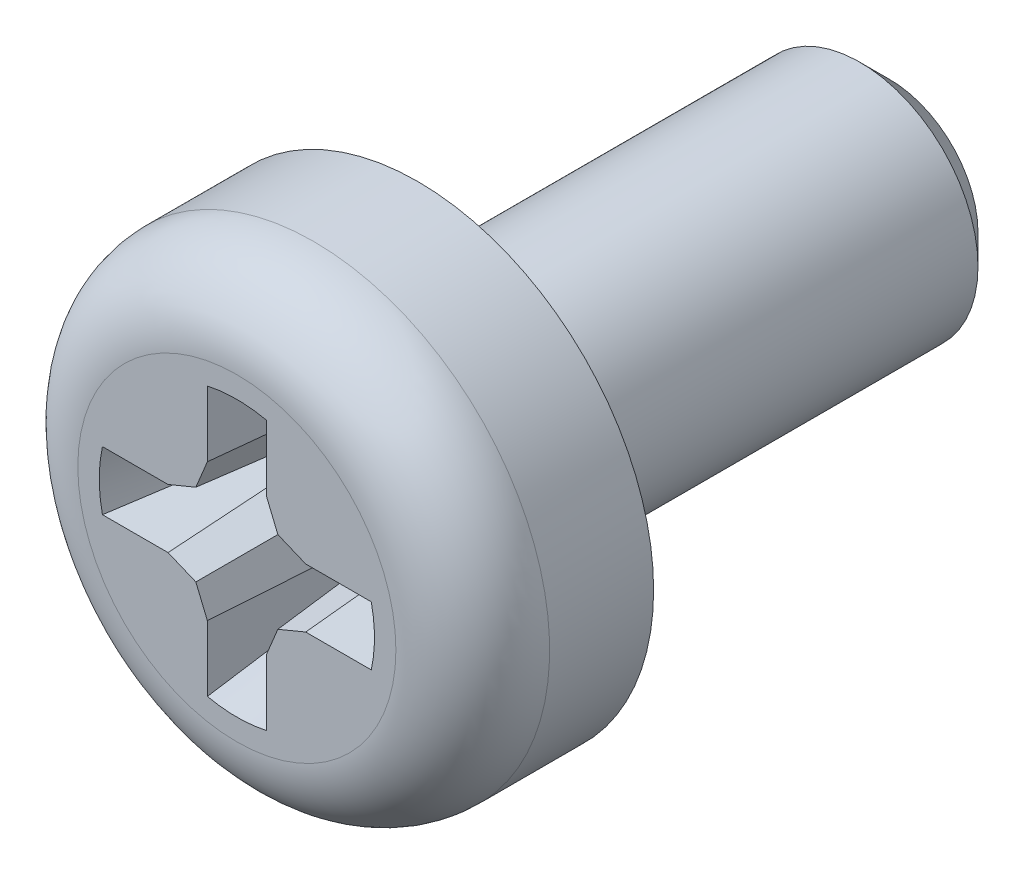
ISO-10303-21;
HEADER;
FILE_DESCRIPTION(('STEP AP214'),'2;1');
FILE_NAME('part.step','',(''),(''),'','','');
FILE_SCHEMA(('AUTOMOTIVE_DESIGN { 1 0 10303 214 1 1 1 1 }'));
ENDSEC;
DATA;
#1=APPLICATION_CONTEXT('core data for automotive mechanical design processes');
#2=APPLICATION_PROTOCOL_DEFINITION('international standard','automotive_design',2000,#1);
#3=PRODUCT_CONTEXT('',#1,'mechanical');
#4=PRODUCT('Part','Part','',(#3));
#5=PRODUCT_RELATED_PRODUCT_CATEGORY('part','',(#4));
#6=PRODUCT_DEFINITION_FORMATION('','',#4);
#7=PRODUCT_DEFINITION_CONTEXT('part definition',#1,'design');
#8=PRODUCT_DEFINITION('design','',#6,#7);
#9=PRODUCT_DEFINITION_SHAPE('','',#8);
#10=(LENGTH_UNIT() NAMED_UNIT(*) SI_UNIT(.MILLI.,.METRE.));
#11=(NAMED_UNIT(*) PLANE_ANGLE_UNIT() SI_UNIT($,.RADIAN.));
#12=(NAMED_UNIT(*) SI_UNIT($,.STERADIAN.) SOLID_ANGLE_UNIT());
#13=UNCERTAINTY_MEASURE_WITH_UNIT(LENGTH_MEASURE(1.E-05),#10,'distance_accuracy_value','');
#14=(GEOMETRIC_REPRESENTATION_CONTEXT(3) GLOBAL_UNCERTAINTY_ASSIGNED_CONTEXT((#13)) GLOBAL_UNIT_ASSIGNED_CONTEXT((#10,
#11,#12)) REPRESENTATION_CONTEXT('',''));
#15=CARTESIAN_POINT('',(0.,0.,0.));
#16=DIRECTION('',(0.,0.,1.));
#17=DIRECTION('',(1.,0.,0.));
#18=AXIS2_PLACEMENT_3D('',#15,#16,#17);
#19=CARTESIAN_POINT('',(0.,0.,0.));
#20=DIRECTION('',(0.,0.,1.));
#21=DIRECTION('',(1.,0.,0.));
#22=AXIS2_PLACEMENT_3D('',#19,#20,#21);
#23=PLANE('',#22);
#24=CARTESIAN_POINT('',(0.,0.,0.));
#25=DIRECTION('',(0.,0.,1.));
#26=DIRECTION('',(1.,0.,0.));
#27=AXIS2_PLACEMENT_3D('',#24,#25,#26);
#28=CIRCLE('',#27,6.);
#29=CARTESIAN_POINT('',(6.,0.,0.));
#30=VERTEX_POINT('',#29);
#31=EDGE_CURVE('E56',#30,#30,#28,.T.);
#32=ORIENTED_EDGE('',*,*,#31,.F.);
#33=EDGE_LOOP('',(#32));
#34=FACE_BOUND('',#33,.T.);
#35=CARTESIAN_POINT('',(0.,0.,0.));
#36=DIRECTION('',(0.,0.,1.));
#37=DIRECTION('',(1.,0.,0.));
#38=AXIS2_PLACEMENT_3D('',#35,#36,#37);
#39=CIRCLE('',#38,3.);
#40=CARTESIAN_POINT('',(3.,0.,0.));
#41=VERTEX_POINT('',#40);
#42=EDGE_CURVE('E11',#41,#41,#39,.F.);
#43=ORIENTED_EDGE('',*,*,#42,.F.);
#44=EDGE_LOOP('',(#43));
#45=FACE_BOUND('',#44,.T.);
#46=ADVANCED_FACE('F39',(#34,#45),#23,.F.);
#47=CARTESIAN_POINT('',(0.,0.,4.6));
#48=DIRECTION('',(0.,0.,-1.));
#49=DIRECTION('',(-1.,0.,0.));
#50=AXIS2_PLACEMENT_3D('',#47,#48,#49);
#51=CYLINDRICAL_SURFACE('',#50,6.);
#52=CARTESIAN_POINT('',(0.,0.,2.645));
#53=DIRECTION('',(0.,0.,-1.));
#54=DIRECTION('',(0.,1.,0.));
#55=AXIS2_PLACEMENT_3D('',#52,#53,#54);
#56=CIRCLE('',#55,6.);
#57=CARTESIAN_POINT('',(0.,6.,2.645));
#58=VERTEX_POINT('',#57);
#59=EDGE_CURVE('E456',#58,#58,#56,.T.);
#60=ORIENTED_EDGE('',*,*,#59,.T.);
#61=EDGE_LOOP('',(#60));
#62=FACE_BOUND('',#61,.T.);
#63=ORIENTED_EDGE('',*,*,#31,.T.);
#64=EDGE_LOOP('',(#63));
#65=FACE_BOUND('',#64,.T.);
#66=ADVANCED_FACE('F382',(#62,#65),#51,.T.);
#67=CARTESIAN_POINT('',(0.,0.,2.645));
#68=DIRECTION('',(0.,0.,-1.));
#69=DIRECTION('',(0.,1.,0.));
#70=AXIS2_PLACEMENT_3D('',#67,#68,#69);
#71=TOROIDAL_SURFACE('',#70,4.045,1.955);
#72=ORIENTED_EDGE('',*,*,#59,.F.);
#73=EDGE_LOOP('',(#72));
#74=FACE_BOUND('',#73,.T.);
#75=CARTESIAN_POINT('',(0.,0.,4.6));
#76=DIRECTION('',(0.,0.,-1.));
#77=DIRECTION('',(0.,1.,0.));
#78=AXIS2_PLACEMENT_3D('',#75,#76,#77);
#79=CIRCLE('',#78,4.045);
#80=CARTESIAN_POINT('',(0.,4.045,4.6));
#81=VERTEX_POINT('',#80);
#82=EDGE_CURVE('E452',#81,#81,#79,.T.);
#83=ORIENTED_EDGE('',*,*,#82,.T.);
#84=EDGE_LOOP('',(#83));
#85=FACE_BOUND('',#84,.T.);
#86=ADVANCED_FACE('F388',(#74,#85),#71,.T.);
#87=CARTESIAN_POINT('',(0.,0.,4.6));
#88=DIRECTION('',(0.,0.,1.));
#89=DIRECTION('',(1.,0.,0.));
#90=AXIS2_PLACEMENT_3D('',#87,#88,#89);
#91=PLANE('',#90);
#92=DIRECTION('',(0.,-1.,0.));
#93=VECTOR('',#92,1.);
#94=CARTESIAN_POINT('',(-0.750000000000007,1.75,4.6));
#95=LINE('',#94,#93);
#96=CARTESIAN_POINT('',(-0.750000000000013,3.41869858279433,4.6));
#97=VERTEX_POINT('',#96);
#98=CARTESIAN_POINT('',(-0.750000000000007,1.75,4.6));
#99=VERTEX_POINT('',#98);
#100=EDGE_CURVE('E337',#97,#99,#95,.T.);
#101=ORIENTED_EDGE('',*,*,#100,.F.);
#102=CARTESIAN_POINT('',(0.,0.,4.6));
#103=DIRECTION('',(0.,0.,1.));
#104=DIRECTION('',(1.,0.,0.));
#105=AXIS2_PLACEMENT_3D('',#102,#103,#104);
#106=CIRCLE('',#105,3.5);
#107=CARTESIAN_POINT('',(0.75,3.41869858279434,4.6));
#108=VERTEX_POINT('',#107);
#109=EDGE_CURVE('E344',#108,#97,#106,.T.);
#110=ORIENTED_EDGE('',*,*,#109,.F.);
#111=DIRECTION('',(0.,1.,0.));
#112=VECTOR('',#111,1.);
#113=CARTESIAN_POINT('',(0.75,3.41869858279434,4.6));
#114=LINE('',#113,#112);
#115=CARTESIAN_POINT('',(0.75,1.75,4.6));
#116=VERTEX_POINT('',#115);
#117=EDGE_CURVE('E440',#116,#108,#114,.T.);
#118=ORIENTED_EDGE('',*,*,#117,.F.);
#119=DIRECTION('',(-0.382683432365083,0.923879532511289,0.));
#120=VECTOR('',#119,1.);
#121=CARTESIAN_POINT('',(0.75,1.75,4.6));
#122=LINE('',#121,#120);
#123=CARTESIAN_POINT('',(1.04289321881345,1.04289321881345,4.6));
#124=VERTEX_POINT('',#123);
#125=EDGE_CURVE('E434',#124,#116,#122,.T.);
#126=ORIENTED_EDGE('',*,*,#125,.F.);
#127=DIRECTION('',(-0.92387953251129,0.382683432365083,0.));
#128=VECTOR('',#127,1.);
#129=CARTESIAN_POINT('',(1.75,0.750000000000001,4.6));
#130=LINE('',#129,#128);
#131=CARTESIAN_POINT('',(1.75,0.750000000000001,4.6));
#132=VERTEX_POINT('',#131);
#133=EDGE_CURVE('E193',#132,#124,#130,.T.);
#134=ORIENTED_EDGE('',*,*,#133,.F.);
#135=DIRECTION('',(-1.,0.,0.));
#136=VECTOR('',#135,1.);
#137=CARTESIAN_POINT('',(1.75,0.750000000000001,4.6));
#138=LINE('',#137,#136);
#139=CARTESIAN_POINT('',(3.41869858279434,0.750000000000001,4.6));
#140=VERTEX_POINT('',#139);
#141=EDGE_CURVE('E426',#140,#132,#138,.T.);
#142=ORIENTED_EDGE('',*,*,#141,.F.);
#143=CARTESIAN_POINT('',(0.,0.,4.6));
#144=DIRECTION('',(0.,0.,1.));
#145=DIRECTION('',(1.,0.,0.));
#146=AXIS2_PLACEMENT_3D('',#143,#144,#145);
#147=CIRCLE('',#146,3.5);
#148=CARTESIAN_POINT('',(3.41869858279434,-0.749999999999964,4.6));
#149=VERTEX_POINT('',#148);
#150=EDGE_CURVE('E290',#149,#140,#147,.T.);
#151=ORIENTED_EDGE('',*,*,#150,.F.);
#152=DIRECTION('',(1.,0.,0.));
#153=VECTOR('',#152,1.);
#154=CARTESIAN_POINT('',(3.41869858279434,-0.749999999999964,4.6));
#155=LINE('',#154,#153);
#156=CARTESIAN_POINT('',(1.75000000000001,-0.749999999999982,4.6));
#157=VERTEX_POINT('',#156);
#158=EDGE_CURVE('E519',#157,#149,#155,.T.);
#159=ORIENTED_EDGE('',*,*,#158,.F.);
#160=DIRECTION('',(0.923879532511285,0.382683432365093,0.));
#161=VECTOR('',#160,1.);
#162=CARTESIAN_POINT('',(1.75000000000001,-0.749999999999982,4.6));
#163=LINE('',#162,#161);
#164=CARTESIAN_POINT('',(1.04289321881346,-1.04289321881344,4.6));
#165=VERTEX_POINT('',#164);
#166=EDGE_CURVE('E522',#165,#157,#163,.T.);
#167=ORIENTED_EDGE('',*,*,#166,.F.);
#168=DIRECTION('',(0.382683432365073,0.923879532511294,0.));
#169=VECTOR('',#168,1.);
#170=CARTESIAN_POINT('',(0.750000000000019,-1.74999999999999,4.6));
#171=LINE('',#170,#169);
#172=CARTESIAN_POINT('',(0.750000000000019,-1.74999999999999,4.6));
#173=VERTEX_POINT('',#172);
#174=EDGE_CURVE('E525',#173,#165,#171,.T.);
#175=ORIENTED_EDGE('',*,*,#174,.F.);
#176=DIRECTION('',(0.,1.,0.));
#177=VECTOR('',#176,1.);
#178=CARTESIAN_POINT('',(0.750000000000019,-1.74999999999999,4.6));
#179=LINE('',#178,#177);
#180=CARTESIAN_POINT('',(0.750000000000037,-3.41869858279433,4.6));
#181=VERTEX_POINT('',#180);
#182=EDGE_CURVE('E528',#181,#173,#179,.T.);
#183=ORIENTED_EDGE('',*,*,#182,.F.);
#184=CARTESIAN_POINT('',(0.,0.,4.6));
#185=DIRECTION('',(0.,0.,1.));
#186=DIRECTION('',(-1.,0.,0.));
#187=AXIS2_PLACEMENT_3D('',#184,#185,#186);
#188=CIRCLE('',#187,3.5);
#189=CARTESIAN_POINT('',(-0.749999999999976,-3.41869858279434,4.6));
#190=VERTEX_POINT('',#189);
#191=EDGE_CURVE('E499',#190,#181,#188,.T.);
#192=ORIENTED_EDGE('',*,*,#191,.F.);
#193=DIRECTION('',(0.,-1.,0.));
#194=VECTOR('',#193,1.);
#195=CARTESIAN_POINT('',(-0.749999999999976,-3.41869858279434,4.6));
#196=LINE('',#195,#194);
#197=CARTESIAN_POINT('',(-0.749999999999988,-1.75,4.6));
#198=VERTEX_POINT('',#197);
#199=EDGE_CURVE('E503',#198,#190,#196,.T.);
#200=ORIENTED_EDGE('',*,*,#199,.F.);
#201=DIRECTION('',(0.38268343236509,-0.923879532511287,0.));
#202=VECTOR('',#201,1.);
#203=CARTESIAN_POINT('',(-0.749999999999988,-1.75,4.6));
#204=LINE('',#203,#202);
#205=CARTESIAN_POINT('',(-1.04289321881344,-1.04289321881346,4.6));
#206=VERTEX_POINT('',#205);
#207=EDGE_CURVE('E507',#206,#198,#204,.T.);
#208=ORIENTED_EDGE('',*,*,#207,.F.);
#209=DIRECTION('',(0.923879532511292,-0.382683432365077,0.));
#210=VECTOR('',#209,1.);
#211=CARTESIAN_POINT('',(-1.74999999999999,-0.750000000000013,4.6));
#212=LINE('',#211,#210);
#213=CARTESIAN_POINT('',(-1.74999999999999,-0.750000000000013,4.6));
#214=VERTEX_POINT('',#213);
#215=EDGE_CURVE('E511',#214,#206,#212,.T.);
#216=ORIENTED_EDGE('',*,*,#215,.F.);
#217=DIRECTION('',(1.,0.,0.));
#218=VECTOR('',#217,1.);
#219=CARTESIAN_POINT('',(-1.74999999999999,-0.750000000000013,4.6));
#220=LINE('',#219,#218);
#221=CARTESIAN_POINT('',(-3.41869858279433,-0.750000000000025,4.6));
#222=VERTEX_POINT('',#221);
#223=EDGE_CURVE('E515',#222,#214,#220,.T.);
#224=ORIENTED_EDGE('',*,*,#223,.F.);
#225=CARTESIAN_POINT('',(0.,0.,4.6));
#226=DIRECTION('',(0.,0.,1.));
#227=DIRECTION('',(0.,1.,0.));
#228=AXIS2_PLACEMENT_3D('',#225,#226,#227);
#229=CIRCLE('',#228,3.5);
#230=CARTESIAN_POINT('',(-3.41869858279434,0.749999999999988,4.6));
#231=VERTEX_POINT('',#230);
#232=EDGE_CURVE('E138',#231,#222,#229,.T.);
#233=ORIENTED_EDGE('',*,*,#232,.F.);
#234=DIRECTION('',(-1.,0.,0.));
#235=VECTOR('',#234,1.);
#236=CARTESIAN_POINT('',(-3.41869858279434,0.749999999999988,4.6));
#237=LINE('',#236,#235);
#238=CARTESIAN_POINT('',(-1.75,0.749999999999994,4.6));
#239=VERTEX_POINT('',#238);
#240=EDGE_CURVE('E484',#239,#231,#237,.T.);
#241=ORIENTED_EDGE('',*,*,#240,.F.);
#242=DIRECTION('',(-0.923879532511288,-0.382683432365087,0.));
#243=VECTOR('',#242,1.);
#244=CARTESIAN_POINT('',(-1.75,0.749999999999994,4.6));
#245=LINE('',#244,#243);
#246=CARTESIAN_POINT('',(-1.04289321881345,1.04289321881344,4.6));
#247=VERTEX_POINT('',#246);
#248=EDGE_CURVE('E487',#247,#239,#245,.T.);
#249=ORIENTED_EDGE('',*,*,#248,.F.);
#250=DIRECTION('',(-0.38268343236508,-0.923879532511291,0.));
#251=VECTOR('',#250,1.);
#252=CARTESIAN_POINT('',(-0.750000000000007,1.75,4.6));
#253=LINE('',#252,#251);
#254=EDGE_CURVE('E493',#99,#247,#253,.T.);
#255=ORIENTED_EDGE('',*,*,#254,.F.);
#256=EDGE_LOOP('',(#101,#110,#118,#126,#134,#142,#151,#159,#167,#175,#183,#192,#200,#208,#216,
#224,#233,#241,#249,#255));
#257=FACE_BOUND('',#256,.T.);
#258=ORIENTED_EDGE('',*,*,#82,.F.);
#259=EDGE_LOOP('',(#258));
#260=FACE_BOUND('',#259,.T.);
#261=ADVANCED_FACE('F393',(#257,#260),#91,.T.);
#262=CARTESIAN_POINT('',(0.,0.,-12.));
#263=DIRECTION('',(0.,0.,1.));
#264=DIRECTION('',(1.,0.,0.));
#265=AXIS2_PLACEMENT_3D('',#262,#263,#264);
#266=PLANE('',#265);
#267=CARTESIAN_POINT('',(0.,0.,-12.));
#268=DIRECTION('',(0.,0.,1.));
#269=DIRECTION('',(1.,0.,0.));
#270=AXIS2_PLACEMENT_3D('',#267,#268,#269);
#271=CIRCLE('',#270,2.25);
#272=CARTESIAN_POINT('',(2.25,0.,-12.));
#273=VERTEX_POINT('',#272);
#274=EDGE_CURVE('E448',#273,#273,#271,.F.);
#275=ORIENTED_EDGE('',*,*,#274,.T.);
#276=EDGE_LOOP('',(#275));
#277=FACE_BOUND('',#276,.T.);
#278=ADVANCED_FACE('F396',(#277),#266,.F.);
#279=CARTESIAN_POINT('',(0.,0.,0.));
#280=DIRECTION('',(0.,0.,1.));
#281=DIRECTION('',(1.,0.,0.));
#282=AXIS2_PLACEMENT_3D('',#279,#280,#281);
#283=CYLINDRICAL_SURFACE('',#282,3.);
#284=CARTESIAN_POINT('',(0.,0.,-11.25));
#285=DIRECTION('',(0.,0.,1.));
#286=DIRECTION('',(1.,0.,0.));
#287=AXIS2_PLACEMENT_3D('',#284,#285,#286);
#288=CIRCLE('',#287,3.);
#289=CARTESIAN_POINT('',(3.,0.,-11.25));
#290=VERTEX_POINT('',#289);
#291=EDGE_CURVE('E229',#290,#290,#288,.T.);
#292=ORIENTED_EDGE('',*,*,#291,.T.);
#293=EDGE_LOOP('',(#292));
#294=FACE_BOUND('',#293,.T.);
#295=ORIENTED_EDGE('',*,*,#42,.T.);
#296=EDGE_LOOP('',(#295));
#297=FACE_BOUND('',#296,.T.);
#298=ADVANCED_FACE('F403',(#294,#297),#283,.T.);
#299=CARTESIAN_POINT('',(0.,0.,-11.25));
#300=DIRECTION('',(0.,0.,1.));
#301=DIRECTION('',(1.,0.,0.));
#302=AXIS2_PLACEMENT_3D('',#299,#300,#301);
#303=CONICAL_SURFACE('',#302,3.,0.78539816339745);
#304=ORIENTED_EDGE('',*,*,#274,.F.);
#305=EDGE_LOOP('',(#304));
#306=FACE_BOUND('',#305,.T.);
#307=ORIENTED_EDGE('',*,*,#291,.F.);
#308=EDGE_LOOP('',(#307));
#309=FACE_BOUND('',#308,.T.);
#310=ADVANCED_FACE('F238',(#306,#309),#303,.T.);
#311=CARTESIAN_POINT('',(0.,0.,4.6));
#312=DIRECTION('',(0.,0.,1.));
#313=DIRECTION('',(1.,0.,0.));
#314=AXIS2_PLACEMENT_3D('',#311,#312,#313);
#315=CONICAL_SURFACE('',#314,3.5,0.26179938779915);
#316=ORIENTED_EDGE('',*,*,#109,.T.);
#317=CARTESIAN_POINT('',(-0.750000000000013,3.41869858279433,4.6));
#318=CARTESIAN_POINT('',(-0.710856778549137,3.30454759683965,4.15259093151792));
#319=CARTESIAN_POINT('',(-0.671715101074905,3.1903268185757,3.70519951076964));
#320=CARTESIAN_POINT('',(-0.593436589596938,2.96166801188712,2.81047203039419));
#321=CARTESIAN_POINT('',(-0.554299755590619,2.84722998357892,2.36313597073748));
#322=CARTESIAN_POINT('',(-0.476032630076546,2.61805884652935,1.46853863252485));
#323=CARTESIAN_POINT('',(-0.436902338571229,2.50332573767834,1.02127735399678));
#324=CARTESIAN_POINT('',(-0.358652173333514,2.27339188214119,0.126873872629991));
#325=CARTESIAN_POINT('',(-0.319532299606891,2.15819113519644,-0.320268330142725));
#326=CARTESIAN_POINT('',(-0.280419586778715,2.04267033263685,-0.767328683471651));
#327=B_SPLINE_CURVE_WITH_KNOTS('',3,(#317,#318,#319,#320,#321,#322,#323,#324,#325,#326),
.UNSPECIFIED.,.F.,.F.,(4,2,2,2,4),(0.,1.39019339885548,2.78038605289869,4.17057922355598,
5.56077316310951),.UNSPECIFIED.);
#328=CARTESIAN_POINT('',(-0.407919325613646,2.41815396990681,0.690000000000001));
#329=VERTEX_POINT('',#328);
#330=EDGE_CURVE('E247',#329,#97,#327,.F.);
#331=ORIENTED_EDGE('',*,*,#330,.F.);
#332=CARTESIAN_POINT('',(0.,0.,0.690000000000001));
#333=DIRECTION('',(0.,0.,1.));
#334=DIRECTION('',(1.,0.,0.));
#335=AXIS2_PLACEMENT_3D('',#332,#333,#334);
#336=CIRCLE('',#335,2.45231865759431);
#337=CARTESIAN_POINT('',(0.407919325613637,2.41815396990681,0.690000000000001));
#338=VERTEX_POINT('',#337);
#339=EDGE_CURVE('E220',#338,#329,#336,.T.);
#340=ORIENTED_EDGE('',*,*,#339,.F.);
#341=CARTESIAN_POINT('',(0.407919325613637,2.41815396990681,0.690000000000001));
#342=CARTESIAN_POINT('',(0.43641875898141,2.5018605095434,1.0157500139927));
#343=CARTESIAN_POINT('',(0.464920647876248,2.58545687454731,1.3415280947882));
#344=CARTESIAN_POINT('',(0.521928331743197,2.7524738591027,1.99312890304671));
#345=CARTESIAN_POINT('',(0.550434126714608,2.83589447868563,2.31895163050173));
#346=CARTESIAN_POINT('',(0.607448625554528,3.00260459910938,2.97063033425774));
#347=CARTESIAN_POINT('',(0.635957329422791,3.08589409996127,3.29648631055592));
#348=CARTESIAN_POINT('',(0.692977066110881,3.25236833626034,3.94822488319047));
#349=CARTESIAN_POINT('',(0.721488098931119,3.33555307168896,4.27410747953154));
#350=CARTESIAN_POINT('',(0.75,3.41869858279434,4.6));
#351=B_SPLINE_CURVE_WITH_KNOTS('',3,(#341,#342,#343,#344,#345,#346,#347,#348,#349,#350),
.UNSPECIFIED.,.F.,.F.,(4,2,2,2,4),(0.,1.01261470752405,2.02522923382559,3.03784367470439,
4.05045829503657),.UNSPECIFIED.);
#352=EDGE_CURVE('E65',#338,#108,#351,.T.);
#353=ORIENTED_EDGE('',*,*,#352,.T.);
#354=EDGE_LOOP('',(#316,#331,#340,#353));
#355=FACE_BOUND('',#354,.T.);
#356=ADVANCED_FACE('F235',(#355),#315,.F.);
#357=CARTESIAN_POINT('',(0.75,3.41869858279434,4.6));
#358=DIRECTION('',(-0.996194698091746,0.,0.0871557427476584));
#359=DIRECTION('',(0.0871557427476584,0.,0.996194698091746));
#360=AXIS2_PLACEMENT_3D('',#357,#358,#359);
#361=PLANE('',#360);
#362=ORIENTED_EDGE('',*,*,#117,.T.);
#363=ORIENTED_EDGE('',*,*,#352,.F.);
#364=DIRECTION('',(0.,-1.,0.));
#365=VECTOR('',#364,1.);
#366=CARTESIAN_POINT('',(0.407919325613637,0.,0.690000000000001));
#367=LINE('',#366,#365);
#368=CARTESIAN_POINT('',(0.407919325613637,1.68195592322298,0.690000000000001));
#369=VERTEX_POINT('',#368);
#370=EDGE_CURVE('E207',#369,#338,#367,.F.);
#371=ORIENTED_EDGE('',*,*,#370,.F.);
#372=DIRECTION('',(0.0871426484044397,0.0173337504938599,0.996045029063886));
#373=VECTOR('',#372,1.);
#374=CARTESIAN_POINT('',(0.75252058410214,1.75050137535094,4.62881040812097));
#375=LINE('',#374,#373);
#376=EDGE_CURVE('E198',#369,#116,#375,.T.);
#377=ORIENTED_EDGE('',*,*,#376,.T.);
#378=EDGE_LOOP('',(#362,#363,#371,#377));
#379=FACE_BOUND('',#378,.T.);
#380=ADVANCED_FACE('F231',(#379),#361,.T.);
#381=CARTESIAN_POINT('',(0.75,1.75,4.6));
#382=DIRECTION('',(-0.920363891963227,-0.381227206369647,0.0871557427476584));
#383=DIRECTION('',(0.382683432365083,-0.923879532511289,0.));
#384=AXIS2_PLACEMENT_3D('',#381,#382,#383);
#385=PLANE('',#384);
#386=ORIENTED_EDGE('',*,*,#125,.T.);
#387=ORIENTED_EDGE('',*,*,#376,.F.);
#388=DIRECTION('',(0.382683432365083,-0.923879532511289,0.));
#389=VECTOR('',#388,1.);
#390=CARTESIAN_POINT('',(0.942842142949959,0.390538002786778,0.690000000000001));
#391=LINE('',#390,#389);
#392=CARTESIAN_POINT('',(0.781076005573571,0.781076005573572,0.690000000000001));
#393=VERTEX_POINT('',#392);
#394=EDGE_CURVE('E202',#393,#369,#391,.F.);
#395=ORIENTED_EDGE('',*,*,#394,.F.);
#396=DIRECTION('',(0.0666626913468325,0.0666626913468326,0.995546167269401));
#397=VECTOR('',#396,1.);
#398=CARTESIAN_POINT('',(1.04473394843524,1.04473394843525,4.6274896089992));
#399=LINE('',#398,#397);
#400=EDGE_CURVE('E186',#393,#124,#399,.T.);
#401=ORIENTED_EDGE('',*,*,#400,.T.);
#402=EDGE_LOOP('',(#386,#387,#395,#401));
#403=FACE_BOUND('',#402,.T.);
#404=ADVANCED_FACE('F203',(#403),#385,.T.);
#405=CARTESIAN_POINT('',(1.75,0.750000000000001,4.6));
#406=DIRECTION('',(-0.381227206369647,-0.920363891963227,0.0871557427476584));
#407=DIRECTION('',(0.92387953251129,-0.382683432365083,0.));
#408=AXIS2_PLACEMENT_3D('',#405,#406,#407);
#409=PLANE('',#408);
#410=ORIENTED_EDGE('',*,*,#133,.T.);
#411=ORIENTED_EDGE('',*,*,#400,.F.);
#412=DIRECTION('',(0.92387953251129,-0.382683432365083,0.));
#413=VECTOR('',#412,1.);
#414=CARTESIAN_POINT('',(0.390538002786778,0.94284214294996,0.690000000000001));
#415=LINE('',#414,#413);
#416=CARTESIAN_POINT('',(1.68195592322298,0.407919325613637,0.690000000000001));
#417=VERTEX_POINT('',#416);
#418=EDGE_CURVE('E190',#417,#393,#415,.F.);
#419=ORIENTED_EDGE('',*,*,#418,.F.);
#420=DIRECTION('',(0.0173337504938599,0.0871426484044397,0.996045029063886));
#421=VECTOR('',#420,1.);
#422=CARTESIAN_POINT('',(1.75,0.750000000000001,4.6));
#423=LINE('',#422,#421);
#424=EDGE_CURVE('E199',#417,#132,#423,.T.);
#425=ORIENTED_EDGE('',*,*,#424,.T.);
#426=EDGE_LOOP('',(#410,#411,#419,#425));
#427=FACE_BOUND('',#426,.T.);
#428=ADVANCED_FACE('F188',(#427),#409,.T.);
#429=CARTESIAN_POINT('',(1.75,0.750000000000001,4.6));
#430=DIRECTION('',(0.,-0.996194698091745,0.0871557427476584));
#431=DIRECTION('',(0.,-0.0871557427476584,-0.996194698091746));
#432=AXIS2_PLACEMENT_3D('',#429,#430,#431);
#433=PLANE('',#432);
#434=ORIENTED_EDGE('',*,*,#141,.T.);
#435=ORIENTED_EDGE('',*,*,#424,.F.);
#436=DIRECTION('',(1.,0.,0.));
#437=VECTOR('',#436,1.);
#438=CARTESIAN_POINT('',(0.,0.407919325613637,0.690000000000001));
#439=LINE('',#438,#437);
#440=CARTESIAN_POINT('',(2.41815396990681,0.407919325613637,0.690000000000001));
#441=VERTEX_POINT('',#440);
#442=EDGE_CURVE('E211',#441,#417,#439,.F.);
#443=ORIENTED_EDGE('',*,*,#442,.F.);
#444=CARTESIAN_POINT('',(3.41869858279434,0.750000000000001,4.6));
#445=CARTESIAN_POINT('',(3.30454759683965,0.710856778549125,4.15259093151792));
#446=CARTESIAN_POINT('',(3.1903268185757,0.671715101074894,3.70519951076964));
#447=CARTESIAN_POINT('',(2.96166801188712,0.593436589596928,2.81047203039419));
#448=CARTESIAN_POINT('',(2.84722998357892,0.55429975559061,2.36313597073748));
#449=CARTESIAN_POINT('',(2.61805884652936,0.476032630076537,1.46853863252485));
#450=CARTESIAN_POINT('',(2.50332573767835,0.43690233857122,1.02127735399678));
#451=CARTESIAN_POINT('',(2.27339188214119,0.358652173333506,0.126873872629992));
#452=CARTESIAN_POINT('',(2.15819113519644,0.319532299606883,-0.320268330142724));
#453=CARTESIAN_POINT('',(2.04267033263685,0.280419586778708,-0.76732868347165));
#454=B_SPLINE_CURVE_WITH_KNOTS('',3,(#444,#445,#446,#447,#448,#449,#450,#451,#452,#453),
.UNSPECIFIED.,.F.,.F.,(4,2,2,2,4),(0.,1.39019339885548,2.78038605289869,4.17057922355597,
5.56077316310951),.UNSPECIFIED.);
#455=EDGE_CURVE('E422',#441,#140,#454,.F.);
#456=ORIENTED_EDGE('',*,*,#455,.T.);
#457=EDGE_LOOP('',(#434,#435,#443,#456));
#458=FACE_BOUND('',#457,.T.);
#459=ADVANCED_FACE('F243',(#458),#433,.T.);
#460=CARTESIAN_POINT('',(0.,0.,4.6));
#461=DIRECTION('',(0.,0.,1.));
#462=DIRECTION('',(1.,0.,0.));
#463=AXIS2_PLACEMENT_3D('',#460,#461,#462);
#464=CONICAL_SURFACE('',#463,3.5,0.26179938779915);
#465=ORIENTED_EDGE('',*,*,#150,.T.);
#466=ORIENTED_EDGE('',*,*,#455,.F.);
#467=CARTESIAN_POINT('',(0.,0.,0.690000000000001));
#468=DIRECTION('',(0.,0.,1.));
#469=DIRECTION('',(1.,0.,0.));
#470=AXIS2_PLACEMENT_3D('',#467,#468,#469);
#471=CIRCLE('',#470,2.45231865759431);
#472=CARTESIAN_POINT('',(2.41815396990681,-0.407919325613611,0.690000000000001));
#473=VERTEX_POINT('',#472);
#474=EDGE_CURVE('E129',#473,#441,#471,.T.);
#475=ORIENTED_EDGE('',*,*,#474,.F.);
#476=CARTESIAN_POINT('',(2.41815396990681,-0.407919325613611,0.690000000000001));
#477=CARTESIAN_POINT('',(2.5018605095434,-0.436418758981383,1.0157500139927));
#478=CARTESIAN_POINT('',(2.58545687454732,-0.46492064787622,1.3415280947882));
#479=CARTESIAN_POINT('',(2.75247385910271,-0.521928331743168,1.99312890304671));
#480=CARTESIAN_POINT('',(2.83589447868563,-0.550434126714579,2.31895163050173));
#481=CARTESIAN_POINT('',(3.00260459910939,-0.607448625554497,2.97063033425774));
#482=CARTESIAN_POINT('',(3.08589409996128,-0.635957329422759,3.29648631055592));
#483=CARTESIAN_POINT('',(3.25236833626035,-0.692977066110847,3.94822488319047));
#484=CARTESIAN_POINT('',(3.33555307168897,-0.721488098931084,4.27410747953154));
#485=CARTESIAN_POINT('',(3.41869858279434,-0.749999999999964,4.6));
#486=B_SPLINE_CURVE_WITH_KNOTS('',3,(#476,#477,#478,#479,#480,#481,#482,#483,#484,#485),
.UNSPECIFIED.,.F.,.F.,(4,2,2,2,4),(0.,1.01261470752405,2.02522923382559,3.03784367470439,
4.05045829503657),.UNSPECIFIED.);
#487=EDGE_CURVE('E43',#473,#149,#486,.T.);
#488=ORIENTED_EDGE('',*,*,#487,.T.);
#489=EDGE_LOOP('',(#465,#466,#475,#488));
#490=FACE_BOUND('',#489,.T.);
#491=ADVANCED_FACE('F240',(#490),#464,.F.);
#492=CARTESIAN_POINT('',(0.,0.,0.690000000000001));
#493=DIRECTION('',(0.,0.,1.));
#494=DIRECTION('',(1.,0.,0.));
#495=AXIS2_PLACEMENT_3D('',#492,#493,#494);
#496=PLANE('',#495);
#497=ORIENTED_EDGE('',*,*,#339,.T.);
#498=DIRECTION('',(0.,1.,0.));
#499=VECTOR('',#498,1.);
#500=CARTESIAN_POINT('',(-0.407919325613637,0.,0.690000000000001));
#501=LINE('',#500,#499);
#502=CARTESIAN_POINT('',(-0.407919325613643,1.68195592322298,0.690000000000001));
#503=VERTEX_POINT('',#502);
#504=EDGE_CURVE('E261',#329,#503,#501,.F.);
#505=ORIENTED_EDGE('',*,*,#504,.T.);
#506=DIRECTION('',(0.38268343236508,0.923879532511291,0.));
#507=VECTOR('',#506,1.);
#508=CARTESIAN_POINT('',(-0.942842142949961,0.390538002786774,0.690000000000001));
#509=LINE('',#508,#507);
#510=CARTESIAN_POINT('',(-0.781076005573574,0.781076005573568,0.690000000000001));
#511=VERTEX_POINT('',#510);
#512=EDGE_CURVE('E480',#503,#511,#509,.F.);
#513=ORIENTED_EDGE('',*,*,#512,.T.);
#514=DIRECTION('',(0.923879532511288,0.382683432365087,0.));
#515=VECTOR('',#514,1.);
#516=CARTESIAN_POINT('',(-0.390538002786781,0.942842142949958,0.690000000000001));
#517=LINE('',#516,#515);
#518=CARTESIAN_POINT('',(-1.68195592322298,0.407919325613631,0.690000000000001));
#519=VERTEX_POINT('',#518);
#520=EDGE_CURVE('E483',#511,#519,#517,.F.);
#521=ORIENTED_EDGE('',*,*,#520,.T.);
#522=DIRECTION('',(1.,0.,0.));
#523=VECTOR('',#522,1.);
#524=CARTESIAN_POINT('',(0.,0.407919325613637,0.690000000000001));
#525=LINE('',#524,#523);
#526=CARTESIAN_POINT('',(-2.41815396990681,0.407919325613628,0.690000000000001));
#527=VERTEX_POINT('',#526);
#528=EDGE_CURVE('E291',#519,#527,#525,.F.);
#529=ORIENTED_EDGE('',*,*,#528,.T.);
#530=CARTESIAN_POINT('',(0.,0.,0.690000000000001));
#531=DIRECTION('',(0.,0.,1.));
#532=DIRECTION('',(1.,0.,0.));
#533=AXIS2_PLACEMENT_3D('',#530,#531,#532);
#534=CIRCLE('',#533,2.45231865759431);
#535=CARTESIAN_POINT('',(-2.41815396990681,-0.407919325613654,0.690000000000001));
#536=VERTEX_POINT('',#535);
#537=EDGE_CURVE('E258',#527,#536,#534,.T.);
#538=ORIENTED_EDGE('',*,*,#537,.T.);
#539=DIRECTION('',(-1.,0.,0.));
#540=VECTOR('',#539,1.);
#541=CARTESIAN_POINT('',(0.,-0.407919325613638,0.690000000000001));
#542=LINE('',#541,#540);
#543=CARTESIAN_POINT('',(-1.68195592322298,-0.407919325613649,0.690000000000001));
#544=VERTEX_POINT('',#543);
#545=EDGE_CURVE('E312',#536,#544,#542,.F.);
#546=ORIENTED_EDGE('',*,*,#545,.T.);
#547=DIRECTION('',(-0.923879532511292,0.382683432365077,0.));
#548=VECTOR('',#547,1.);
#549=CARTESIAN_POINT('',(-0.390538002786771,-0.942842142949962,0.690000000000001));
#550=LINE('',#549,#548);
#551=CARTESIAN_POINT('',(-0.781076005573565,-0.781076005573577,0.690000000000001));
#552=VERTEX_POINT('',#551);
#553=EDGE_CURVE('E766',#544,#552,#550,.F.);
#554=ORIENTED_EDGE('',*,*,#553,.T.);
#555=DIRECTION('',(-0.38268343236509,0.923879532511287,0.));
#556=VECTOR('',#555,1.);
#557=CARTESIAN_POINT('',(-0.942842142949957,-0.390538002786784,0.690000000000001));
#558=LINE('',#557,#556);
#559=CARTESIAN_POINT('',(-0.407919325613625,-1.68195592322298,0.690000000000001));
#560=VERTEX_POINT('',#559);
#561=EDGE_CURVE('E557',#552,#560,#558,.F.);
#562=ORIENTED_EDGE('',*,*,#561,.T.);
#563=DIRECTION('',(0.,1.,0.));
#564=VECTOR('',#563,1.);
#565=CARTESIAN_POINT('',(-0.407919325613637,0.,0.690000000000001));
#566=LINE('',#565,#564);
#567=CARTESIAN_POINT('',(-0.40791932561362,-2.41815396990681,0.690000000000001));
#568=VERTEX_POINT('',#567);
#569=EDGE_CURVE('E338',#560,#568,#566,.F.);
#570=ORIENTED_EDGE('',*,*,#569,.T.);
#571=CARTESIAN_POINT('',(0.,0.,0.690000000000001));
#572=DIRECTION('',(0.,0.,1.));
#573=DIRECTION('',(1.,0.,0.));
#574=AXIS2_PLACEMENT_3D('',#571,#572,#573);
#575=CIRCLE('',#574,2.45231865759431);
#576=CARTESIAN_POINT('',(0.407919325613663,-2.4181539699068,0.690000000000001));
#577=VERTEX_POINT('',#576);
#578=EDGE_CURVE('E309',#568,#577,#575,.T.);
#579=ORIENTED_EDGE('',*,*,#578,.T.);
#580=DIRECTION('',(0.,-1.,0.));
#581=VECTOR('',#580,1.);
#582=CARTESIAN_POINT('',(0.407919325613637,0.,0.690000000000001));
#583=LINE('',#582,#581);
#584=CARTESIAN_POINT('',(0.407919325613655,-1.68195592322298,0.690000000000001));
#585=VERTEX_POINT('',#584);
#586=EDGE_CURVE('E365',#577,#585,#583,.F.);
#587=ORIENTED_EDGE('',*,*,#586,.T.);
#588=DIRECTION('',(-0.382683432365073,-0.923879532511294,0.));
#589=VECTOR('',#588,1.);
#590=CARTESIAN_POINT('',(0.942842142949964,-0.390538002786768,0.690000000000001));
#591=LINE('',#590,#589);
#592=CARTESIAN_POINT('',(0.78107600557358,-0.781076005573563,0.690000000000001));
#593=VERTEX_POINT('',#592);
#594=EDGE_CURVE('E774',#585,#593,#591,.F.);
#595=ORIENTED_EDGE('',*,*,#594,.T.);
#596=DIRECTION('',(-0.923879532511285,-0.382683432365093,0.));
#597=VECTOR('',#596,1.);
#598=CARTESIAN_POINT('',(0.390538002786788,-0.942842142949956,0.690000000000001));
#599=LINE('',#598,#597);
#600=CARTESIAN_POINT('',(1.68195592322298,-0.407919325613619,0.690000000000001));
#601=VERTEX_POINT('',#600);
#602=EDGE_CURVE('E777',#593,#601,#599,.F.);
#603=ORIENTED_EDGE('',*,*,#602,.T.);
#604=DIRECTION('',(-1.,0.,0.));
#605=VECTOR('',#604,1.);
#606=CARTESIAN_POINT('',(0.,-0.407919325613637,0.690000000000001));
#607=LINE('',#606,#605);
#608=EDGE_CURVE('E364',#601,#473,#607,.F.);
#609=ORIENTED_EDGE('',*,*,#608,.T.);
#610=ORIENTED_EDGE('',*,*,#474,.T.);
#611=ORIENTED_EDGE('',*,*,#442,.T.);
#612=ORIENTED_EDGE('',*,*,#418,.T.);
#613=ORIENTED_EDGE('',*,*,#394,.T.);
#614=ORIENTED_EDGE('',*,*,#370,.T.);
#615=EDGE_LOOP('',(#497,#505,#513,#521,#529,#538,#546,#554,#562,#570,#579,#587,#595,#603,#609,
#610,#611,#612,#613,#614));
#616=FACE_BOUND('',#615,.T.);
#617=ADVANCED_FACE('F209',(#616),#496,.T.);
#618=CARTESIAN_POINT('',(0.,0.,4.6));
#619=DIRECTION('',(0.,0.,1.));
#620=DIRECTION('',(0.,1.,0.));
#621=AXIS2_PLACEMENT_3D('',#618,#619,#620);
#622=CONICAL_SURFACE('',#621,3.5,0.26179938779915);
#623=ORIENTED_EDGE('',*,*,#232,.T.);
#624=CARTESIAN_POINT('',(-3.41869858279433,-0.750000000000025,4.6));
#625=CARTESIAN_POINT('',(-3.30454759683965,-0.710856778549148,4.15259093151792));
#626=CARTESIAN_POINT('',(-3.19032681857569,-0.671715101074916,3.70519951076964));
#627=CARTESIAN_POINT('',(-2.96166801188712,-0.593436589596949,2.81047203039419));
#628=CARTESIAN_POINT('',(-2.84722998357892,-0.554299755590629,2.36313597073748));
#629=CARTESIAN_POINT('',(-2.61805884652935,-0.476032630076555,1.46853863252485));
#630=CARTESIAN_POINT('',(-2.50332573767834,-0.436902338571237,1.02127735399678));
#631=CARTESIAN_POINT('',(-2.27339188214119,-0.358652173333522,0.126873872629991));
#632=CARTESIAN_POINT('',(-2.15819113519644,-0.319532299606898,-0.320268330142725));
#633=CARTESIAN_POINT('',(-2.04267033263685,-0.280419586778722,-0.767328683471651));
#634=B_SPLINE_CURVE_WITH_KNOTS('',3,(#624,#625,#626,#627,#628,#629,#630,#631,#632,#633),
.UNSPECIFIED.,.F.,.F.,(4,2,2,2,4),(0.,1.39019339885548,2.78038605289869,4.17057922355598,
5.56077316310951),.UNSPECIFIED.);
#635=EDGE_CURVE('E299',#536,#222,#634,.F.);
#636=ORIENTED_EDGE('',*,*,#635,.F.);
#637=ORIENTED_EDGE('',*,*,#537,.F.);
#638=CARTESIAN_POINT('',(-2.41815396990681,0.407919325613628,0.690000000000001));
#639=CARTESIAN_POINT('',(-2.5018605095434,0.436418758981401,1.0157500139927));
#640=CARTESIAN_POINT('',(-2.58545687454731,0.464920647876238,1.3415280947882));
#641=CARTESIAN_POINT('',(-2.7524738591027,0.521928331743187,1.99312890304671));
#642=CARTESIAN_POINT('',(-2.83589447868563,0.550434126714598,2.31895163050173));
#643=CARTESIAN_POINT('',(-3.00260459910938,0.607448625554518,2.97063033425774));
#644=CARTESIAN_POINT('',(-3.08589409996127,0.63595732942278,3.29648631055592));
#645=CARTESIAN_POINT('',(-3.25236833626034,0.69297706611087,3.94822488319047));
#646=CARTESIAN_POINT('',(-3.33555307168896,0.721488098931108,4.27410747953154));
#647=CARTESIAN_POINT('',(-3.41869858279434,0.749999999999988,4.6));
#648=B_SPLINE_CURVE_WITH_KNOTS('',3,(#638,#639,#640,#641,#642,#643,#644,#645,#646,#647),
.UNSPECIFIED.,.F.,.F.,(4,2,2,2,4),(0.,1.01261470752405,2.02522923382559,3.03784367470439,
4.05045829503657),.UNSPECIFIED.);
#649=EDGE_CURVE('E282',#527,#231,#648,.T.);
#650=ORIENTED_EDGE('',*,*,#649,.T.);
#651=EDGE_LOOP('',(#623,#636,#637,#650));
#652=FACE_BOUND('',#651,.T.);
#653=ADVANCED_FACE('F278',(#652),#622,.F.);
#654=CARTESIAN_POINT('',(-3.41869858279434,0.749999999999988,4.6));
#655=DIRECTION('',(0.,-0.996194698091746,0.0871557427476584));
#656=DIRECTION('',(0.,-0.0871557427476584,-0.996194698091746));
#657=AXIS2_PLACEMENT_3D('',#654,#655,#656);
#658=PLANE('',#657);
#659=ORIENTED_EDGE('',*,*,#240,.T.);
#660=ORIENTED_EDGE('',*,*,#649,.F.);
#661=ORIENTED_EDGE('',*,*,#528,.F.);
#662=DIRECTION('',(-0.0173337504938603,0.0871426484044396,0.996045029063886));
#663=VECTOR('',#662,1.);
#664=CARTESIAN_POINT('',(-1.75050137535094,0.752520584102134,4.62881040812097));
#665=LINE('',#664,#663);
#666=EDGE_CURVE('E259',#519,#239,#665,.T.);
#667=ORIENTED_EDGE('',*,*,#666,.T.);
#668=EDGE_LOOP('',(#659,#660,#661,#667));
#669=FACE_BOUND('',#668,.T.);
#670=ADVANCED_FACE('F273',(#669),#658,.T.);
#671=CARTESIAN_POINT('',(-1.75,0.749999999999994,4.6));
#672=DIRECTION('',(0.38122720636965,-0.920363891963226,0.0871557427476584));
#673=DIRECTION('',(0.923879532511288,0.382683432365087,0.));
#674=AXIS2_PLACEMENT_3D('',#671,#672,#673);
#675=PLANE('',#674);
#676=ORIENTED_EDGE('',*,*,#248,.T.);
#677=ORIENTED_EDGE('',*,*,#666,.F.);
#678=ORIENTED_EDGE('',*,*,#520,.F.);
#679=DIRECTION('',(-0.0666626913468328,0.0666626913468323,0.995546167269401));
#680=VECTOR('',#679,1.);
#681=CARTESIAN_POINT('',(-1.04473394843525,1.04473394843524,4.6274896089992));
#682=LINE('',#681,#680);
#683=EDGE_CURVE('E576',#511,#247,#682,.T.);
#684=ORIENTED_EDGE('',*,*,#683,.T.);
#685=EDGE_LOOP('',(#676,#677,#678,#684));
#686=FACE_BOUND('',#685,.T.);
#687=ADVANCED_FACE('F277',(#686),#675,.T.);
#688=CARTESIAN_POINT('',(-0.750000000000007,1.75,4.6));
#689=DIRECTION('',(0.920363891963228,-0.381227206369644,0.0871557427476584));
#690=DIRECTION('',(0.38268343236508,0.923879532511291,0.));
#691=AXIS2_PLACEMENT_3D('',#688,#689,#690);
#692=PLANE('',#691);
#693=ORIENTED_EDGE('',*,*,#254,.T.);
#694=ORIENTED_EDGE('',*,*,#683,.F.);
#695=ORIENTED_EDGE('',*,*,#512,.F.);
#696=DIRECTION('',(-0.0871426484044397,0.0173337504938596,0.996045029063886));
#697=VECTOR('',#696,1.);
#698=CARTESIAN_POINT('',(-0.750000000000007,1.75,4.6));
#699=LINE('',#698,#697);
#700=EDGE_CURVE('E257',#503,#99,#699,.T.);
#701=ORIENTED_EDGE('',*,*,#700,.T.);
#702=EDGE_LOOP('',(#693,#694,#695,#701));
#703=FACE_BOUND('',#702,.T.);
#704=ADVANCED_FACE('F269',(#703),#692,.T.);
#705=CARTESIAN_POINT('',(-0.750000000000007,1.75,4.6));
#706=DIRECTION('',(0.996194698091745,0.,0.0871557427476584));
#707=DIRECTION('',(0.0871557427476584,0.,-0.996194698091746));
#708=AXIS2_PLACEMENT_3D('',#705,#706,#707);
#709=PLANE('',#708);
#710=ORIENTED_EDGE('',*,*,#100,.T.);
#711=ORIENTED_EDGE('',*,*,#700,.F.);
#712=ORIENTED_EDGE('',*,*,#504,.F.);
#713=ORIENTED_EDGE('',*,*,#330,.T.);
#714=EDGE_LOOP('',(#710,#711,#712,#713));
#715=FACE_BOUND('',#714,.T.);
#716=ADVANCED_FACE('F263',(#715),#709,.T.);
#717=CARTESIAN_POINT('',(0.,0.,4.6));
#718=DIRECTION('',(0.,0.,1.));
#719=DIRECTION('',(-1.,0.,0.));
#720=AXIS2_PLACEMENT_3D('',#717,#718,#719);
#721=CONICAL_SURFACE('',#720,3.5,0.26179938779915);
#722=ORIENTED_EDGE('',*,*,#191,.T.);
#723=CARTESIAN_POINT('',(0.750000000000037,-3.41869858279433,4.6));
#724=CARTESIAN_POINT('',(0.71085677854916,-3.30454759683964,4.15259093151792));
#725=CARTESIAN_POINT('',(0.671715101074927,-3.19032681857569,3.70519951076964));
#726=CARTESIAN_POINT('',(0.593436589596959,-2.96166801188711,2.81047203039419));
#727=CARTESIAN_POINT('',(0.554299755590639,-2.84722998357892,2.36313597073748));
#728=CARTESIAN_POINT('',(0.476032630076564,-2.61805884652935,1.46853863252485));
#729=CARTESIAN_POINT('',(0.436902338571246,-2.50332573767834,1.02127735399678));
#730=CARTESIAN_POINT('',(0.35865217333353,-2.27339188214119,0.126873872629991));
#731=CARTESIAN_POINT('',(0.319532299606906,-2.15819113519644,-0.320268330142724));
#732=CARTESIAN_POINT('',(0.280419586778729,-2.04267033263685,-0.767328683471652));
#733=B_SPLINE_CURVE_WITH_KNOTS('',3,(#723,#724,#725,#726,#727,#728,#729,#730,#731,#732),
.UNSPECIFIED.,.F.,.F.,(4,2,2,2,4),(0.,1.39019339885548,2.78038605289869,4.17057922355598,
5.56077316310951),.UNSPECIFIED.);
#734=EDGE_CURVE('E350',#577,#181,#733,.F.);
#735=ORIENTED_EDGE('',*,*,#734,.F.);
#736=ORIENTED_EDGE('',*,*,#578,.F.);
#737=CARTESIAN_POINT('',(-0.40791932561362,-2.41815396990681,0.690000000000001));
#738=CARTESIAN_POINT('',(-0.436418758981392,-2.5018605095434,1.0157500139927));
#739=CARTESIAN_POINT('',(-0.464920647876229,-2.58545687454731,1.3415280947882));
#740=CARTESIAN_POINT('',(-0.521928331743178,-2.7524738591027,1.99312890304671));
#741=CARTESIAN_POINT('',(-0.550434126714588,-2.83589447868563,2.31895163050173));
#742=CARTESIAN_POINT('',(-0.607448625554507,-3.00260459910939,2.97063033425774));
#743=CARTESIAN_POINT('',(-0.63595732942277,-3.08589409996127,3.29648631055592));
#744=CARTESIAN_POINT('',(-0.692977066110858,-3.25236833626035,3.94822488319047));
#745=CARTESIAN_POINT('',(-0.721488098931096,-3.33555307168896,4.27410747953154));
#746=CARTESIAN_POINT('',(-0.749999999999976,-3.41869858279434,4.6));
#747=B_SPLINE_CURVE_WITH_KNOTS('',3,(#737,#738,#739,#740,#741,#742,#743,#744,#745,#746),
.UNSPECIFIED.,.F.,.F.,(4,2,2,2,4),(0.,1.01261470752405,2.02522923382559,3.03784367470439,
4.05045829503656),.UNSPECIFIED.);
#748=EDGE_CURVE('E329',#568,#190,#747,.T.);
#749=ORIENTED_EDGE('',*,*,#748,.T.);
#750=EDGE_LOOP('',(#722,#735,#736,#749));
#751=FACE_BOUND('',#750,.T.);
#752=ADVANCED_FACE('F268',(#751),#721,.F.);
#753=CARTESIAN_POINT('',(-0.749999999999976,-3.41869858279434,4.6));
#754=DIRECTION('',(0.996194698091746,0.,0.0871557427476584));
#755=DIRECTION('',(0.0871557427476584,0.,-0.996194698091746));
#756=AXIS2_PLACEMENT_3D('',#753,#754,#755);
#757=PLANE('',#756);
#758=ORIENTED_EDGE('',*,*,#199,.T.);
#759=ORIENTED_EDGE('',*,*,#748,.F.);
#760=ORIENTED_EDGE('',*,*,#569,.F.);
#761=DIRECTION('',(-0.0871426484044396,-0.0173337504938606,0.996045029063886));
#762=VECTOR('',#761,1.);
#763=CARTESIAN_POINT('',(-0.752520584102128,-1.75050137535094,4.62881040812097));
#764=LINE('',#763,#762);
#765=EDGE_CURVE('E310',#560,#198,#764,.T.);
#766=ORIENTED_EDGE('',*,*,#765,.T.);
#767=EDGE_LOOP('',(#758,#759,#760,#766));
#768=FACE_BOUND('',#767,.T.);
#769=ADVANCED_FACE('F321',(#768),#757,.T.);
#770=CARTESIAN_POINT('',(-0.749999999999988,-1.75,4.6));
#771=DIRECTION('',(0.920363891963224,0.381227206369653,0.0871557427476584));
#772=DIRECTION('',(-0.38268343236509,0.923879532511287,0.));
#773=AXIS2_PLACEMENT_3D('',#770,#771,#772);
#774=PLANE('',#773);
#775=ORIENTED_EDGE('',*,*,#207,.T.);
#776=ORIENTED_EDGE('',*,*,#765,.F.);
#777=ORIENTED_EDGE('',*,*,#561,.F.);
#778=DIRECTION('',(-0.0666626913468321,-0.066662691346833,0.995546167269401));
#779=VECTOR('',#778,1.);
#780=CARTESIAN_POINT('',(-1.04473394843524,-1.04473394843525,4.6274896089992));
#781=LINE('',#780,#779);
#782=EDGE_CURVE('E556',#552,#206,#781,.T.);
#783=ORIENTED_EDGE('',*,*,#782,.T.);
#784=EDGE_LOOP('',(#775,#776,#777,#783));
#785=FACE_BOUND('',#784,.T.);
#786=ADVANCED_FACE('F325',(#785),#774,.T.);
#787=CARTESIAN_POINT('',(-1.74999999999999,-0.750000000000013,4.6));
#788=DIRECTION('',(0.38122720636964,0.92036389196323,0.0871557427476584));
#789=DIRECTION('',(-0.923879532511292,0.382683432365077,0.));
#790=AXIS2_PLACEMENT_3D('',#787,#788,#789);
#791=PLANE('',#790);
#792=ORIENTED_EDGE('',*,*,#215,.T.);
#793=ORIENTED_EDGE('',*,*,#782,.F.);
#794=ORIENTED_EDGE('',*,*,#553,.F.);
#795=DIRECTION('',(-0.0173337504938593,-0.0871426484044398,0.996045029063886));
#796=VECTOR('',#795,1.);
#797=CARTESIAN_POINT('',(-1.74999999999999,-0.750000000000013,4.6));
#798=LINE('',#797,#796);
#799=EDGE_CURVE('E308',#544,#214,#798,.T.);
#800=ORIENTED_EDGE('',*,*,#799,.T.);
#801=EDGE_LOOP('',(#792,#793,#794,#800));
#802=FACE_BOUND('',#801,.T.);
#803=ADVANCED_FACE('F319',(#802),#791,.T.);
#804=CARTESIAN_POINT('',(-1.74999999999999,-0.750000000000013,4.6));
#805=DIRECTION('',(0.,0.996194698091745,0.0871557427476584));
#806=DIRECTION('',(0.,-0.0871557427476584,0.996194698091746));
#807=AXIS2_PLACEMENT_3D('',#804,#805,#806);
#808=PLANE('',#807);
#809=ORIENTED_EDGE('',*,*,#223,.T.);
#810=ORIENTED_EDGE('',*,*,#799,.F.);
#811=ORIENTED_EDGE('',*,*,#545,.F.);
#812=ORIENTED_EDGE('',*,*,#635,.T.);
#813=EDGE_LOOP('',(#809,#810,#811,#812));
#814=FACE_BOUND('',#813,.T.);
#815=ADVANCED_FACE('F314',(#814),#808,.T.);
#816=CARTESIAN_POINT('',(3.41869858279434,-0.749999999999964,4.6));
#817=DIRECTION('',(0.,0.996194698091746,0.0871557427476584));
#818=DIRECTION('',(0.,-0.0871557427476584,0.996194698091746));
#819=AXIS2_PLACEMENT_3D('',#816,#817,#818);
#820=PLANE('',#819);
#821=ORIENTED_EDGE('',*,*,#158,.T.);
#822=ORIENTED_EDGE('',*,*,#487,.F.);
#823=ORIENTED_EDGE('',*,*,#608,.F.);
#824=DIRECTION('',(0.0173337504938609,-0.0871426484044395,0.996045029063886));
#825=VECTOR('',#824,1.);
#826=CARTESIAN_POINT('',(1.75050137535094,-0.752520584102122,4.62881040812097));
#827=LINE('',#826,#825);
#828=EDGE_CURVE('E121',#601,#157,#827,.T.);
#829=ORIENTED_EDGE('',*,*,#828,.T.);
#830=EDGE_LOOP('',(#821,#822,#823,#829));
#831=FACE_BOUND('',#830,.T.);
#832=ADVANCED_FACE('F318',(#831),#820,.T.);
#833=CARTESIAN_POINT('',(1.75000000000001,-0.749999999999982,4.6));
#834=DIRECTION('',(-0.381227206369657,0.920363891963223,0.0871557427476584));
#835=DIRECTION('',(-0.923879532511285,-0.382683432365093,0.));
#836=AXIS2_PLACEMENT_3D('',#833,#834,#835);
#837=PLANE('',#836);
#838=ORIENTED_EDGE('',*,*,#166,.T.);
#839=ORIENTED_EDGE('',*,*,#828,.F.);
#840=ORIENTED_EDGE('',*,*,#602,.F.);
#841=DIRECTION('',(0.0666626913468333,-0.0666626913468319,0.995546167269401));
#842=VECTOR('',#841,1.);
#843=CARTESIAN_POINT('',(1.04473394843526,-1.04473394843523,4.6274896089992));
#844=LINE('',#843,#842);
#845=EDGE_CURVE('E349',#593,#165,#844,.T.);
#846=ORIENTED_EDGE('',*,*,#845,.T.);
#847=EDGE_LOOP('',(#838,#839,#840,#846));
#848=FACE_BOUND('',#847,.T.);
#849=ADVANCED_FACE('F41',(#848),#837,.T.);
#850=CARTESIAN_POINT('',(0.750000000000019,-1.74999999999999,4.6));
#851=DIRECTION('',(-0.920363891963231,0.381227206369637,0.0871557427476584));
#852=DIRECTION('',(-0.382683432365073,-0.923879532511294,0.));
#853=AXIS2_PLACEMENT_3D('',#850,#851,#852);
#854=PLANE('',#853);
#855=ORIENTED_EDGE('',*,*,#174,.T.);
#856=ORIENTED_EDGE('',*,*,#845,.F.);
#857=ORIENTED_EDGE('',*,*,#594,.F.);
#858=DIRECTION('',(0.0871426484044399,-0.017333750493859,0.996045029063886));
#859=VECTOR('',#858,1.);
#860=CARTESIAN_POINT('',(0.750000000000019,-1.74999999999999,4.6));
#861=LINE('',#860,#859);
#862=EDGE_CURVE('E345',#585,#173,#861,.T.);
#863=ORIENTED_EDGE('',*,*,#862,.T.);
#864=EDGE_LOOP('',(#855,#856,#857,#863));
#865=FACE_BOUND('',#864,.T.);
#866=ADVANCED_FACE('F370',(#865),#854,.T.);
#867=CARTESIAN_POINT('',(0.750000000000019,-1.74999999999999,4.6));
#868=DIRECTION('',(-0.996194698091745,0.,0.0871557427476584));
#869=DIRECTION('',(0.0871557427476584,0.,0.996194698091746));
#870=AXIS2_PLACEMENT_3D('',#867,#868,#869);
#871=PLANE('',#870);
#872=ORIENTED_EDGE('',*,*,#182,.T.);
#873=ORIENTED_EDGE('',*,*,#862,.F.);
#874=ORIENTED_EDGE('',*,*,#586,.F.);
#875=ORIENTED_EDGE('',*,*,#734,.T.);
#876=EDGE_LOOP('',(#872,#873,#874,#875));
#877=FACE_BOUND('',#876,.T.);
#878=ADVANCED_FACE('F367',(#877),#871,.T.);
#879=CLOSED_SHELL('',(#46,#66,#86,#261,#278,#298,#310,#356,#380,#404,#428,#459,#491,#617,#653,
#670,#687,#704,#716,#752,#769,#786,#803,#815,#832,#849,#866,#878));
#880=MANIFOLD_SOLID_BREP('B2',#879);
#881=ADVANCED_BREP_SHAPE_REPRESENTATION('',(#18,#880),#14);
#882=SHAPE_DEFINITION_REPRESENTATION(#9,#881);
ENDSEC;
END-ISO-10303-21;
